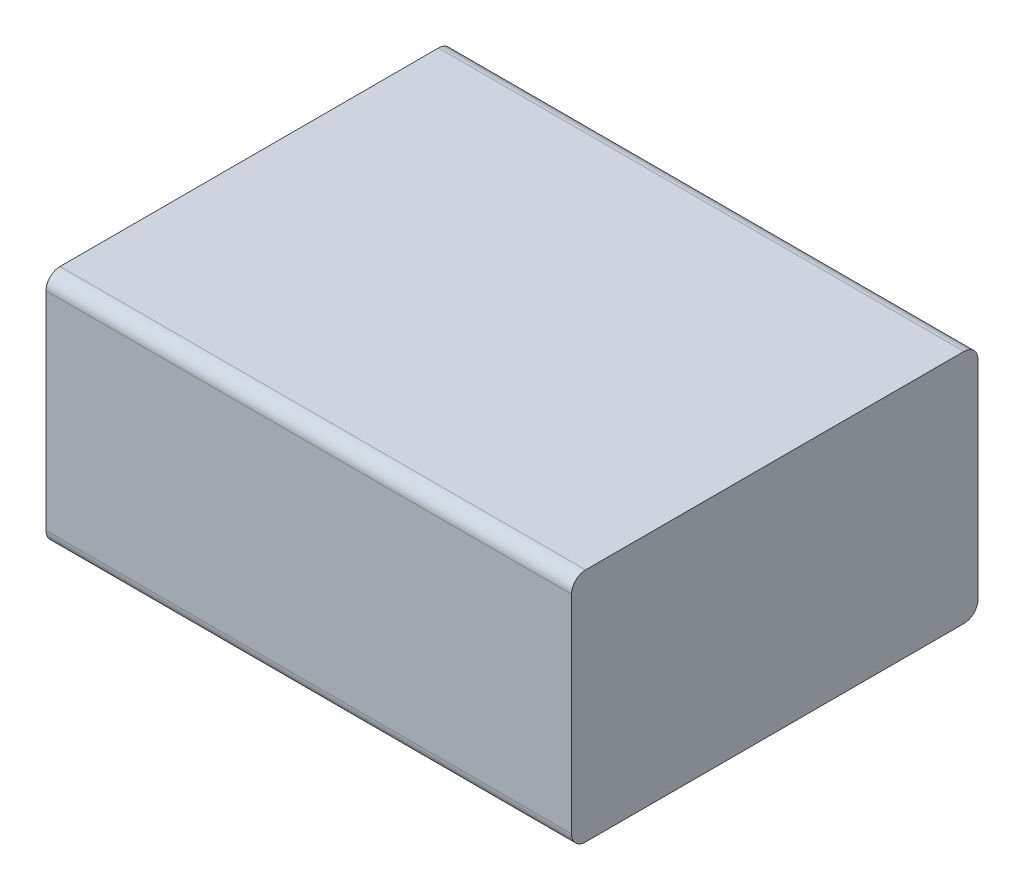
ISO-10303-21;
HEADER;
FILE_DESCRIPTION(('STEP AP214'),'2;1');
FILE_NAME('part.step','',(''),(''),'','','');
FILE_SCHEMA(('AUTOMOTIVE_DESIGN { 1 0 10303 214 1 1 1 1 }'));
ENDSEC;
DATA;
#1=APPLICATION_CONTEXT('core data for automotive mechanical design processes');
#2=APPLICATION_PROTOCOL_DEFINITION('international standard','automotive_design',2000,#1);
#3=PRODUCT_CONTEXT('',#1,'mechanical');
#4=PRODUCT('Part','Part','',(#3));
#5=PRODUCT_RELATED_PRODUCT_CATEGORY('part','',(#4));
#6=PRODUCT_DEFINITION_FORMATION('','',#4);
#7=PRODUCT_DEFINITION_CONTEXT('part definition',#1,'design');
#8=PRODUCT_DEFINITION('design','',#6,#7);
#9=PRODUCT_DEFINITION_SHAPE('','',#8);
#10=(LENGTH_UNIT() NAMED_UNIT(*) SI_UNIT(.MILLI.,.METRE.));
#11=(NAMED_UNIT(*) PLANE_ANGLE_UNIT() SI_UNIT($,.RADIAN.));
#12=(NAMED_UNIT(*) SI_UNIT($,.STERADIAN.) SOLID_ANGLE_UNIT());
#13=UNCERTAINTY_MEASURE_WITH_UNIT(LENGTH_MEASURE(1.E-05),#10,'distance_accuracy_value','');
#14=(GEOMETRIC_REPRESENTATION_CONTEXT(3) GLOBAL_UNCERTAINTY_ASSIGNED_CONTEXT((#13)) GLOBAL_UNIT_ASSIGNED_CONTEXT((#10,
#11,#12)) REPRESENTATION_CONTEXT('',''));
#15=CARTESIAN_POINT('',(0.,0.,0.));
#16=DIRECTION('',(0.,0.,1.));
#17=DIRECTION('',(1.,0.,0.));
#18=AXIS2_PLACEMENT_3D('',#15,#16,#17);
#19=CARTESIAN_POINT('',(1.,0.95,-0.8));
#20=DIRECTION('',(1.,0.,0.));
#21=DIRECTION('',(0.,0.,1.));
#22=AXIS2_PLACEMENT_3D('',#19,#20,#21);
#23=PLANE('',#22);
#24=CARTESIAN_POINT('',(0.999999999976353,0.87,-0.72));
#25=DIRECTION('',(1.,0.,0.));
#26=DIRECTION('',(0.,0.,-1.));
#27=AXIS2_PLACEMENT_3D('',#24,#25,#26);
#28=CIRCLE('',#27,0.0533333333333333);
#29=CARTESIAN_POINT('',(1.00000000009,0.87,-0.773333333333333));
#30=VERTEX_POINT('',#29);
#31=CARTESIAN_POINT('',(1.00000000009,0.923333333333333,-0.72));
#32=VERTEX_POINT('',#31);
#33=EDGE_CURVE('E11',#30,#32,#28,.T.);
#34=ORIENTED_EDGE('',*,*,#33,.T.);
#35=DIRECTION('',(0.,0.,1.));
#36=VECTOR('',#35,1.);
#37=CARTESIAN_POINT('',(0.999999999976353,0.923333333333333,-0.72000000011113));
#38=LINE('',#37,#36);
#39=CARTESIAN_POINT('',(1.00000000009,0.923333333333333,0.719999999999999));
#40=VERTEX_POINT('',#39);
#41=EDGE_CURVE('E24',#32,#40,#38,.T.);
#42=ORIENTED_EDGE('',*,*,#41,.T.);
#43=CARTESIAN_POINT('',(0.999999999976353,0.87,0.72));
#44=DIRECTION('',(1.,0.,0.));
#45=DIRECTION('',(0.,0.,-1.));
#46=AXIS2_PLACEMENT_3D('',#43,#44,#45);
#47=CIRCLE('',#46,0.0533333333333333);
#48=CARTESIAN_POINT('',(1.00000000009,0.87,0.773333333333333));
#49=VERTEX_POINT('',#48);
#50=EDGE_CURVE('E99',#40,#49,#47,.T.);
#51=ORIENTED_EDGE('',*,*,#50,.T.);
#52=DIRECTION('',(0.,-1.,0.));
#53=VECTOR('',#52,1.);
#54=CARTESIAN_POINT('',(0.999999999976353,0.87,0.773333333333333));
#55=LINE('',#54,#53);
#56=CARTESIAN_POINT('',(1.00000000009,0.0800000000000004,0.773333333333333));
#57=VERTEX_POINT('',#56);
#58=EDGE_CURVE('E141',#49,#57,#55,.T.);
#59=ORIENTED_EDGE('',*,*,#58,.T.);
#60=CARTESIAN_POINT('',(0.999999999976353,0.08,0.72));
#61=DIRECTION('',(1.,0.,0.));
#62=DIRECTION('',(0.,0.,-1.));
#63=AXIS2_PLACEMENT_3D('',#60,#61,#62);
#64=CIRCLE('',#63,0.0533333333333333);
#65=CARTESIAN_POINT('',(1.00000000009,0.0266666666666667,0.72));
#66=VERTEX_POINT('',#65);
#67=EDGE_CURVE('E139',#57,#66,#64,.T.);
#68=ORIENTED_EDGE('',*,*,#67,.T.);
#69=DIRECTION('',(0.,0.,-1.));
#70=VECTOR('',#69,1.);
#71=CARTESIAN_POINT('',(0.999999999976353,0.0266666666666667,0.719999999888869));
#72=LINE('',#71,#70);
#73=CARTESIAN_POINT('',(1.00000000009,0.0266666666666667,-0.72));
#74=VERTEX_POINT('',#73);
#75=EDGE_CURVE('E137',#66,#74,#72,.T.);
#76=ORIENTED_EDGE('',*,*,#75,.T.);
#77=CARTESIAN_POINT('',(0.999999999976353,0.08,-0.72));
#78=DIRECTION('',(1.,0.,0.));
#79=DIRECTION('',(0.,0.,-1.));
#80=AXIS2_PLACEMENT_3D('',#77,#78,#79);
#81=CIRCLE('',#80,0.0533333333333333);
#82=CARTESIAN_POINT('',(1.00000000009,0.08,-0.773333333333333));
#83=VERTEX_POINT('',#82);
#84=EDGE_CURVE('E135',#74,#83,#81,.T.);
#85=ORIENTED_EDGE('',*,*,#84,.T.);
#86=DIRECTION('',(0.,1.,0.));
#87=VECTOR('',#86,1.);
#88=CARTESIAN_POINT('',(0.999999999976353,0.08,-0.773333333333333));
#89=LINE('',#88,#87);
#90=EDGE_CURVE('E133',#83,#30,#89,.T.);
#91=ORIENTED_EDGE('',*,*,#90,.T.);
#92=EDGE_LOOP('',(#34,#42,#51,#59,#68,#76,#85,#91));
#93=FACE_BOUND('',#92,.T.);
#94=ADVANCED_FACE('F17',(#93),#23,.T.);
#95=CARTESIAN_POINT('',(-1.,0.87,-0.72));
#96=DIRECTION('',(1.,0.,0.));
#97=DIRECTION('',(0.,0.,-1.));
#98=AXIS2_PLACEMENT_3D('',#95,#96,#97);
#99=PLANE('',#98);
#100=CARTESIAN_POINT('',(-1.,0.87,-0.72));
#101=DIRECTION('',(1.,0.,0.));
#102=DIRECTION('',(0.,0.,-1.));
#103=AXIS2_PLACEMENT_3D('',#100,#101,#102);
#104=CIRCLE('',#103,0.0533333333333333);
#105=CARTESIAN_POINT('',(-1.,0.87,-0.773333333333333));
#106=VERTEX_POINT('',#105);
#107=CARTESIAN_POINT('',(-1.,0.923333333333333,-0.72));
#108=VERTEX_POINT('',#107);
#109=EDGE_CURVE('E131',#106,#108,#104,.T.);
#110=ORIENTED_EDGE('',*,*,#109,.F.);
#111=DIRECTION('',(0.,1.,0.));
#112=VECTOR('',#111,1.);
#113=CARTESIAN_POINT('',(-1.,0.08,-0.773333333333333));
#114=LINE('',#113,#112);
#115=CARTESIAN_POINT('',(-1.,0.08,-0.773333333333333));
#116=VERTEX_POINT('',#115);
#117=EDGE_CURVE('E128',#116,#106,#114,.T.);
#118=ORIENTED_EDGE('',*,*,#117,.F.);
#119=CARTESIAN_POINT('',(-1.,0.08,-0.72));
#120=DIRECTION('',(1.,0.,0.));
#121=DIRECTION('',(0.,0.,-1.));
#122=AXIS2_PLACEMENT_3D('',#119,#120,#121);
#123=CIRCLE('',#122,0.0533333333333333);
#124=CARTESIAN_POINT('',(-1.,0.0266666666666667,-0.719999999999999));
#125=VERTEX_POINT('',#124);
#126=EDGE_CURVE('E125',#125,#116,#123,.T.);
#127=ORIENTED_EDGE('',*,*,#126,.F.);
#128=DIRECTION('',(0.,0.,-1.));
#129=VECTOR('',#128,1.);
#130=CARTESIAN_POINT('',(-1.,0.0266666666666667,0.72));
#131=LINE('',#130,#129);
#132=CARTESIAN_POINT('',(-1.,0.0266666666666667,0.72));
#133=VERTEX_POINT('',#132);
#134=EDGE_CURVE('E122',#133,#125,#131,.T.);
#135=ORIENTED_EDGE('',*,*,#134,.F.);
#136=CARTESIAN_POINT('',(-1.,0.08,0.72));
#137=DIRECTION('',(1.,0.,0.));
#138=DIRECTION('',(0.,0.,-1.));
#139=AXIS2_PLACEMENT_3D('',#136,#137,#138);
#140=CIRCLE('',#139,0.0533333333333333);
#141=CARTESIAN_POINT('',(-1.,0.0800000000000004,0.773333333333333));
#142=VERTEX_POINT('',#141);
#143=EDGE_CURVE('E119',#142,#133,#140,.T.);
#144=ORIENTED_EDGE('',*,*,#143,.F.);
#145=DIRECTION('',(0.,-1.,0.));
#146=VECTOR('',#145,1.);
#147=CARTESIAN_POINT('',(-1.,0.87,0.773333333333333));
#148=LINE('',#147,#146);
#149=CARTESIAN_POINT('',(-1.,0.87,0.773333333333333));
#150=VERTEX_POINT('',#149);
#151=EDGE_CURVE('E84',#150,#142,#148,.T.);
#152=ORIENTED_EDGE('',*,*,#151,.F.);
#153=CARTESIAN_POINT('',(-1.,0.87,0.72));
#154=DIRECTION('',(1.,0.,0.));
#155=DIRECTION('',(0.,0.,-1.));
#156=AXIS2_PLACEMENT_3D('',#153,#154,#155);
#157=CIRCLE('',#156,0.0533333333333333);
#158=CARTESIAN_POINT('',(-1.,0.923333333333333,0.719999999999999));
#159=VERTEX_POINT('',#158);
#160=EDGE_CURVE('E78',#159,#150,#157,.T.);
#161=ORIENTED_EDGE('',*,*,#160,.F.);
#162=DIRECTION('',(0.,0.,1.));
#163=VECTOR('',#162,1.);
#164=CARTESIAN_POINT('',(-1.,0.923333333333333,-0.72));
#165=LINE('',#164,#163);
#166=EDGE_CURVE('E81',#108,#159,#165,.T.);
#167=ORIENTED_EDGE('',*,*,#166,.F.);
#168=EDGE_LOOP('',(#110,#118,#127,#135,#144,#152,#161,#167));
#169=FACE_BOUND('',#168,.T.);
#170=ADVANCED_FACE('F80',(#169),#99,.F.);
#171=CARTESIAN_POINT('',(500000.,0.08,-0.773333333376701));
#172=DIRECTION('',(0.,0.,1.));
#173=DIRECTION('',(1.,0.,0.));
#174=AXIS2_PLACEMENT_3D('',#171,#172,#173);
#175=PLANE('',#174);
#176=ORIENTED_EDGE('',*,*,#90,.F.);
#177=DIRECTION('',(-1.,0.,0.));
#178=VECTOR('',#177,1.);
#179=CARTESIAN_POINT('',(500000.,0.08,-0.773333333376701));
#180=LINE('',#179,#178);
#181=EDGE_CURVE('E95',#83,#116,#180,.T.);
#182=ORIENTED_EDGE('',*,*,#181,.T.);
#183=ORIENTED_EDGE('',*,*,#117,.T.);
#184=DIRECTION('',(-1.,0.,0.));
#185=VECTOR('',#184,1.);
#186=CARTESIAN_POINT('',(500000.,0.87,-0.773333333376701));
#187=LINE('',#186,#185);
#188=EDGE_CURVE('E114',#30,#106,#187,.T.);
#189=ORIENTED_EDGE('',*,*,#188,.F.);
#190=EDGE_LOOP('',(#176,#182,#183,#189));
#191=FACE_BOUND('',#190,.T.);
#192=ADVANCED_FACE('F148',(#191),#175,.F.);
#193=CARTESIAN_POINT('',(500000.,0.08,-0.720000000043368));
#194=DIRECTION('',(-1.,0.,0.));
#195=DIRECTION('',(0.,0.,1.));
#196=AXIS2_PLACEMENT_3D('',#193,#194,#195);
#197=CYLINDRICAL_SURFACE('',#196,0.0533333333333333);
#198=ORIENTED_EDGE('',*,*,#84,.F.);
#199=DIRECTION('',(-1.,0.,0.));
#200=VECTOR('',#199,1.);
#201=CARTESIAN_POINT('',(500000.,0.0266666666666667,-0.720000000043367));
#202=LINE('',#201,#200);
#203=EDGE_CURVE('E111',#74,#125,#202,.T.);
#204=ORIENTED_EDGE('',*,*,#203,.T.);
#205=ORIENTED_EDGE('',*,*,#126,.T.);
#206=ORIENTED_EDGE('',*,*,#181,.F.);
#207=EDGE_LOOP('',(#198,#204,#205,#206));
#208=FACE_BOUND('',#207,.T.);
#209=ADVANCED_FACE('F152',(#208),#197,.T.);
#210=CARTESIAN_POINT('',(500000.,0.0266666666666667,0.719999999956631));
#211=DIRECTION('',(0.,1.,0.));
#212=DIRECTION('',(0.,0.,1.));
#213=AXIS2_PLACEMENT_3D('',#210,#211,#212);
#214=PLANE('',#213);
#215=ORIENTED_EDGE('',*,*,#75,.F.);
#216=DIRECTION('',(-1.,0.,0.));
#217=VECTOR('',#216,1.);
#218=CARTESIAN_POINT('',(500000.,0.0266666666666667,0.719999999956631));
#219=LINE('',#218,#217);
#220=EDGE_CURVE('E108',#66,#133,#219,.T.);
#221=ORIENTED_EDGE('',*,*,#220,.T.);
#222=ORIENTED_EDGE('',*,*,#134,.T.);
#223=ORIENTED_EDGE('',*,*,#203,.F.);
#224=EDGE_LOOP('',(#215,#221,#222,#223));
#225=FACE_BOUND('',#224,.T.);
#226=ADVANCED_FACE('F156',(#225),#214,.F.);
#227=CARTESIAN_POINT('',(500000.,0.08,0.719999999956632));
#228=DIRECTION('',(-1.,0.,0.));
#229=DIRECTION('',(0.,0.,1.));
#230=AXIS2_PLACEMENT_3D('',#227,#228,#229);
#231=CYLINDRICAL_SURFACE('',#230,0.0533333333333333);
#232=ORIENTED_EDGE('',*,*,#67,.F.);
#233=DIRECTION('',(-1.,0.,0.));
#234=VECTOR('',#233,1.);
#235=CARTESIAN_POINT('',(500000.,0.0800000000000004,0.773333333289965));
#236=LINE('',#235,#234);
#237=EDGE_CURVE('E102',#57,#142,#236,.T.);
#238=ORIENTED_EDGE('',*,*,#237,.T.);
#239=ORIENTED_EDGE('',*,*,#143,.T.);
#240=ORIENTED_EDGE('',*,*,#220,.F.);
#241=EDGE_LOOP('',(#232,#238,#239,#240));
#242=FACE_BOUND('',#241,.T.);
#243=ADVANCED_FACE('F160',(#242),#231,.T.);
#244=CARTESIAN_POINT('',(500000.,0.87,0.773333333289965));
#245=DIRECTION('',(0.,0.,-1.));
#246=DIRECTION('',(-1.,0.,0.));
#247=AXIS2_PLACEMENT_3D('',#244,#245,#246);
#248=PLANE('',#247);
#249=ORIENTED_EDGE('',*,*,#58,.F.);
#250=DIRECTION('',(-1.,0.,0.));
#251=VECTOR('',#250,1.);
#252=CARTESIAN_POINT('',(500000.,0.87,0.773333333289965));
#253=LINE('',#252,#251);
#254=EDGE_CURVE('E100',#49,#150,#253,.T.);
#255=ORIENTED_EDGE('',*,*,#254,.T.);
#256=ORIENTED_EDGE('',*,*,#151,.T.);
#257=ORIENTED_EDGE('',*,*,#237,.F.);
#258=EDGE_LOOP('',(#249,#255,#256,#257));
#259=FACE_BOUND('',#258,.T.);
#260=ADVANCED_FACE('F163',(#259),#248,.F.);
#261=CARTESIAN_POINT('',(500000.,0.87,0.719999999956632));
#262=DIRECTION('',(-1.,0.,0.));
#263=DIRECTION('',(0.,0.,1.));
#264=AXIS2_PLACEMENT_3D('',#261,#262,#263);
#265=CYLINDRICAL_SURFACE('',#264,0.0533333333333333);
#266=ORIENTED_EDGE('',*,*,#50,.F.);
#267=DIRECTION('',(-1.,0.,0.));
#268=VECTOR('',#267,1.);
#269=CARTESIAN_POINT('',(500000.,0.923333333333333,0.719999999956631));
#270=LINE('',#269,#268);
#271=EDGE_CURVE('E93',#40,#159,#270,.T.);
#272=ORIENTED_EDGE('',*,*,#271,.T.);
#273=ORIENTED_EDGE('',*,*,#160,.T.);
#274=ORIENTED_EDGE('',*,*,#254,.F.);
#275=EDGE_LOOP('',(#266,#272,#273,#274));
#276=FACE_BOUND('',#275,.T.);
#277=ADVANCED_FACE('F98',(#276),#265,.T.);
#278=CARTESIAN_POINT('',(500000.,0.923333333333333,-0.720000000043368));
#279=DIRECTION('',(0.,-1.,0.));
#280=DIRECTION('',(0.,0.,-1.));
#281=AXIS2_PLACEMENT_3D('',#278,#279,#280);
#282=PLANE('',#281);
#283=ORIENTED_EDGE('',*,*,#41,.F.);
#284=DIRECTION('',(-1.,0.,0.));
#285=VECTOR('',#284,1.);
#286=CARTESIAN_POINT('',(500000.,0.923333333333333,-0.720000000043368));
#287=LINE('',#286,#285);
#288=EDGE_CURVE('E94',#32,#108,#287,.T.);
#289=ORIENTED_EDGE('',*,*,#288,.T.);
#290=ORIENTED_EDGE('',*,*,#166,.T.);
#291=ORIENTED_EDGE('',*,*,#271,.F.);
#292=EDGE_LOOP('',(#283,#289,#290,#291));
#293=FACE_BOUND('',#292,.T.);
#294=ADVANCED_FACE('F92',(#293),#282,.F.);
#295=CARTESIAN_POINT('',(500000.,0.87,-0.720000000043368));
#296=DIRECTION('',(-1.,0.,0.));
#297=DIRECTION('',(0.,0.,1.));
#298=AXIS2_PLACEMENT_3D('',#295,#296,#297);
#299=CYLINDRICAL_SURFACE('',#298,0.0533333333333333);
#300=ORIENTED_EDGE('',*,*,#33,.F.);
#301=ORIENTED_EDGE('',*,*,#188,.T.);
#302=ORIENTED_EDGE('',*,*,#109,.T.);
#303=ORIENTED_EDGE('',*,*,#288,.F.);
#304=EDGE_LOOP('',(#300,#301,#302,#303));
#305=FACE_BOUND('',#304,.T.);
#306=ADVANCED_FACE('F144',(#305),#299,.T.);
#307=CLOSED_SHELL('',(#94,#170,#192,#209,#226,#243,#260,#277,#294,#306));
#308=MANIFOLD_SOLID_BREP('B1',#307);
#309=ADVANCED_BREP_SHAPE_REPRESENTATION('',(#18,#308),#14);
#310=SHAPE_DEFINITION_REPRESENTATION(#9,#309);
ENDSEC;
END-ISO-10303-21;
